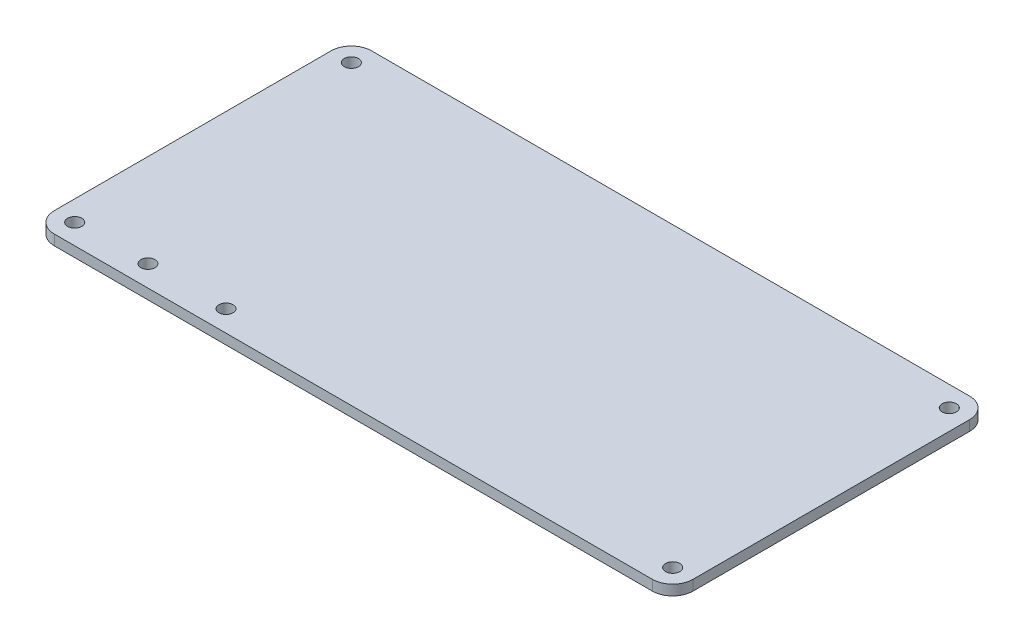
ISO-10303-21;
HEADER;
FILE_DESCRIPTION(('STEP AP214'),'2;1');
FILE_NAME('part.step','',(''),(''),'','','');
FILE_SCHEMA(('AUTOMOTIVE_DESIGN { 1 0 10303 214 1 1 1 1 }'));
ENDSEC;
DATA;
#1=APPLICATION_CONTEXT('core data for automotive mechanical design processes');
#2=APPLICATION_PROTOCOL_DEFINITION('international standard','automotive_design',2000,#1);
#3=PRODUCT_CONTEXT('',#1,'mechanical');
#4=PRODUCT('Part','Part','',(#3));
#5=PRODUCT_RELATED_PRODUCT_CATEGORY('part','',(#4));
#6=PRODUCT_DEFINITION_FORMATION('','',#4);
#7=PRODUCT_DEFINITION_CONTEXT('part definition',#1,'design');
#8=PRODUCT_DEFINITION('design','',#6,#7);
#9=PRODUCT_DEFINITION_SHAPE('','',#8);
#10=(LENGTH_UNIT() NAMED_UNIT(*) SI_UNIT(.MILLI.,.METRE.));
#11=(NAMED_UNIT(*) PLANE_ANGLE_UNIT() SI_UNIT($,.RADIAN.));
#12=(NAMED_UNIT(*) SI_UNIT($,.STERADIAN.) SOLID_ANGLE_UNIT());
#13=UNCERTAINTY_MEASURE_WITH_UNIT(LENGTH_MEASURE(1.E-05),#10,'distance_accuracy_value','');
#14=(GEOMETRIC_REPRESENTATION_CONTEXT(3) GLOBAL_UNCERTAINTY_ASSIGNED_CONTEXT((#13)) GLOBAL_UNIT_ASSIGNED_CONTEXT((#10,
#11,#12)) REPRESENTATION_CONTEXT('',''));
#15=CARTESIAN_POINT('',(0.,0.,0.));
#16=DIRECTION('',(0.,0.,1.));
#17=DIRECTION('',(1.,0.,0.));
#18=AXIS2_PLACEMENT_3D('',#15,#16,#17);
#19=CARTESIAN_POINT('',(3.175,1.6,-46.355));
#20=DIRECTION('',(0.,1.,0.));
#21=DIRECTION('',(0.,0.,1.));
#22=AXIS2_PLACEMENT_3D('',#19,#20,#21);
#23=PLANE('',#22);
#24=CARTESIAN_POINT('',(14.4784732794294,1.6,-3.30199999999999));
#25=DIRECTION('',(0.,1.,0.));
#26=DIRECTION('',(0.,0.,1.));
#27=AXIS2_PLACEMENT_3D('',#24,#25,#26);
#28=CIRCLE('',#27,1.1);
#29=CARTESIAN_POINT('',(14.4784732794294,1.6,-2.20199999999999));
#30=VERTEX_POINT('',#29);
#31=EDGE_CURVE('E251',#30,#30,#28,.T.);
#32=ORIENTED_EDGE('',*,*,#31,.F.);
#33=EDGE_LOOP('',(#32));
#34=FACE_BOUND('',#33,.T.);
#35=CARTESIAN_POINT('',(26.6684732794294,1.6,-3.302));
#36=DIRECTION('',(0.,1.,0.));
#37=DIRECTION('',(0.,0.,1.));
#38=AXIS2_PLACEMENT_3D('',#35,#36,#37);
#39=CIRCLE('',#38,1.1);
#40=CARTESIAN_POINT('',(26.6684732794294,1.6,-2.202));
#41=VERTEX_POINT('',#40);
#42=EDGE_CURVE('E243',#41,#41,#39,.T.);
#43=ORIENTED_EDGE('',*,*,#42,.F.);
#44=EDGE_LOOP('',(#43));
#45=FACE_BOUND('',#44,.T.);
#46=CARTESIAN_POINT('',(96.52,1.6,-3.17499999999997));
#47=DIRECTION('',(0.,1.,0.));
#48=DIRECTION('',(0.,0.,1.));
#49=AXIS2_PLACEMENT_3D('',#46,#47,#48);
#50=CIRCLE('',#49,1.11125);
#51=CARTESIAN_POINT('',(96.52,1.6,-2.06374999999997));
#52=VERTEX_POINT('',#51);
#53=EDGE_CURVE('E223',#52,#52,#50,.T.);
#54=ORIENTED_EDGE('',*,*,#53,.F.);
#55=EDGE_LOOP('',(#54));
#56=FACE_BOUND('',#55,.T.);
#57=CARTESIAN_POINT('',(3.175,1.6,-46.355));
#58=DIRECTION('',(0.,1.,0.));
#59=DIRECTION('',(0.,0.,1.));
#60=AXIS2_PLACEMENT_3D('',#57,#58,#59);
#61=CIRCLE('',#60,1.11125);
#62=CARTESIAN_POINT('',(3.175,1.6,-45.24375));
#63=VERTEX_POINT('',#62);
#64=EDGE_CURVE('E148',#63,#63,#61,.T.);
#65=ORIENTED_EDGE('',*,*,#64,.F.);
#66=EDGE_LOOP('',(#65));
#67=FACE_BOUND('',#66,.T.);
#68=CARTESIAN_POINT('',(3.175,1.6,-46.355));
#69=DIRECTION('',(0.,1.,0.));
#70=DIRECTION('',(0.,0.,1.));
#71=AXIS2_PLACEMENT_3D('',#68,#69,#70);
#72=CIRCLE('',#71,3.17500000000001);
#73=CARTESIAN_POINT('',(3.175,1.6,-49.53));
#74=VERTEX_POINT('',#73);
#75=CARTESIAN_POINT('',(0.,1.6,-46.355));
#76=VERTEX_POINT('',#75);
#77=EDGE_CURVE('E166',#74,#76,#72,.T.);
#78=ORIENTED_EDGE('',*,*,#77,.T.);
#79=DIRECTION('',(0.,0.,1.));
#80=VECTOR('',#79,1.);
#81=CARTESIAN_POINT('',(0.,1.6,-3.175));
#82=LINE('',#81,#80);
#83=CARTESIAN_POINT('',(0.,1.6,-3.175));
#84=VERTEX_POINT('',#83);
#85=EDGE_CURVE('E102',#76,#84,#82,.T.);
#86=ORIENTED_EDGE('',*,*,#85,.T.);
#87=CARTESIAN_POINT('',(3.175,1.6,-3.175));
#88=DIRECTION('',(0.,1.,0.));
#89=DIRECTION('',(0.,0.,-1.));
#90=AXIS2_PLACEMENT_3D('',#87,#88,#89);
#91=CIRCLE('',#90,3.17500000000001);
#92=CARTESIAN_POINT('',(3.175,1.6,0.));
#93=VERTEX_POINT('',#92);
#94=EDGE_CURVE('E187',#84,#93,#91,.T.);
#95=ORIENTED_EDGE('',*,*,#94,.T.);
#96=DIRECTION('',(1.,0.,0.));
#97=VECTOR('',#96,1.);
#98=CARTESIAN_POINT('',(3.175,1.6,0.));
#99=LINE('',#98,#97);
#100=CARTESIAN_POINT('',(96.52,1.6,0.));
#101=VERTEX_POINT('',#100);
#102=EDGE_CURVE('E201',#93,#101,#99,.T.);
#103=ORIENTED_EDGE('',*,*,#102,.T.);
#104=CARTESIAN_POINT('',(96.52,1.6,-3.17499999999997));
#105=DIRECTION('',(0.,1.,0.));
#106=DIRECTION('',(0.,0.,1.));
#107=AXIS2_PLACEMENT_3D('',#104,#105,#106);
#108=CIRCLE('',#107,3.175);
#109=CARTESIAN_POINT('',(99.695,1.6,-3.17499999999997));
#110=VERTEX_POINT('',#109);
#111=EDGE_CURVE('E121',#101,#110,#108,.T.);
#112=ORIENTED_EDGE('',*,*,#111,.T.);
#113=DIRECTION('',(0.,0.,-1.));
#114=VECTOR('',#113,1.);
#115=CARTESIAN_POINT('',(99.695,1.6,-3.17499999999997));
#116=LINE('',#115,#114);
#117=CARTESIAN_POINT('',(99.695,1.6,-46.355));
#118=VERTEX_POINT('',#117);
#119=EDGE_CURVE('E115',#110,#118,#116,.T.);
#120=ORIENTED_EDGE('',*,*,#119,.T.);
#121=CARTESIAN_POINT('',(96.52,1.6,-46.355));
#122=DIRECTION('',(0.,1.,0.));
#123=DIRECTION('',(0.,0.,-1.));
#124=AXIS2_PLACEMENT_3D('',#121,#122,#123);
#125=CIRCLE('',#124,3.175);
#126=CARTESIAN_POINT('',(96.52,1.6,-49.53));
#127=VERTEX_POINT('',#126);
#128=EDGE_CURVE('E119',#118,#127,#125,.T.);
#129=ORIENTED_EDGE('',*,*,#128,.T.);
#130=DIRECTION('',(-1.,0.,0.));
#131=VECTOR('',#130,1.);
#132=CARTESIAN_POINT('',(3.175,1.6,-49.53));
#133=LINE('',#132,#131);
#134=EDGE_CURVE('E59',#127,#74,#133,.T.);
#135=ORIENTED_EDGE('',*,*,#134,.T.);
#136=EDGE_LOOP('',(#78,#86,#95,#103,#112,#120,#129,#135));
#137=FACE_BOUND('',#136,.T.);
#138=CARTESIAN_POINT('',(96.52,1.6,-46.355));
#139=DIRECTION('',(0.,1.,0.));
#140=DIRECTION('',(0.,0.,-1.));
#141=AXIS2_PLACEMENT_3D('',#138,#139,#140);
#142=CIRCLE('',#141,1.11125);
#143=CARTESIAN_POINT('',(96.52,1.6,-47.46625));
#144=VERTEX_POINT('',#143);
#145=EDGE_CURVE('E215',#144,#144,#142,.T.);
#146=ORIENTED_EDGE('',*,*,#145,.F.);
#147=EDGE_LOOP('',(#146));
#148=FACE_BOUND('',#147,.T.);
#149=CARTESIAN_POINT('',(3.175,1.6,-3.175));
#150=DIRECTION('',(0.,1.,0.));
#151=DIRECTION('',(0.,0.,-1.));
#152=AXIS2_PLACEMENT_3D('',#149,#150,#151);
#153=CIRCLE('',#152,1.11125);
#154=CARTESIAN_POINT('',(3.175,1.6,-4.28625));
#155=VERTEX_POINT('',#154);
#156=EDGE_CURVE('E231',#155,#155,#153,.T.);
#157=ORIENTED_EDGE('',*,*,#156,.F.);
#158=EDGE_LOOP('',(#157));
#159=FACE_BOUND('',#158,.T.);
#160=ADVANCED_FACE('F41',(#34,#45,#56,#67,#137,#148,#159),#23,.T.);
#161=CARTESIAN_POINT('',(3.175,0.,-46.355));
#162=DIRECTION('',(0.,1.,0.));
#163=DIRECTION('',(0.,0.,1.));
#164=AXIS2_PLACEMENT_3D('',#161,#162,#163);
#165=PLANE('',#164);
#166=CARTESIAN_POINT('',(14.4784732794294,0.,-3.30199999999999));
#167=DIRECTION('',(0.,1.,0.));
#168=DIRECTION('',(0.,0.,1.));
#169=AXIS2_PLACEMENT_3D('',#166,#167,#168);
#170=CIRCLE('',#169,1.1);
#171=CARTESIAN_POINT('',(14.4784732794294,0.,-2.20199999999999));
#172=VERTEX_POINT('',#171);
#173=EDGE_CURVE('E239',#172,#172,#170,.T.);
#174=ORIENTED_EDGE('',*,*,#173,.T.);
#175=EDGE_LOOP('',(#174));
#176=FACE_BOUND('',#175,.T.);
#177=CARTESIAN_POINT('',(26.6684732794294,0.,-3.302));
#178=DIRECTION('',(0.,1.,0.));
#179=DIRECTION('',(0.,0.,1.));
#180=AXIS2_PLACEMENT_3D('',#177,#178,#179);
#181=CIRCLE('',#180,1.1);
#182=CARTESIAN_POINT('',(26.6684732794294,0.,-2.202));
#183=VERTEX_POINT('',#182);
#184=EDGE_CURVE('E247',#183,#183,#181,.T.);
#185=ORIENTED_EDGE('',*,*,#184,.T.);
#186=EDGE_LOOP('',(#185));
#187=FACE_BOUND('',#186,.T.);
#188=CARTESIAN_POINT('',(3.175,0.,-46.355));
#189=DIRECTION('',(0.,1.,0.));
#190=DIRECTION('',(0.,0.,1.));
#191=AXIS2_PLACEMENT_3D('',#188,#189,#190);
#192=CIRCLE('',#191,3.17500000000001);
#193=CARTESIAN_POINT('',(3.175,0.,-49.53));
#194=VERTEX_POINT('',#193);
#195=CARTESIAN_POINT('',(0.,0.,-46.355));
#196=VERTEX_POINT('',#195);
#197=EDGE_CURVE('E143',#194,#196,#192,.T.);
#198=ORIENTED_EDGE('',*,*,#197,.F.);
#199=DIRECTION('',(-1.,0.,0.));
#200=VECTOR('',#199,1.);
#201=CARTESIAN_POINT('',(3.175,0.,-49.53));
#202=LINE('',#201,#200);
#203=CARTESIAN_POINT('',(96.52,0.,-49.53));
#204=VERTEX_POINT('',#203);
#205=EDGE_CURVE('E94',#204,#194,#202,.T.);
#206=ORIENTED_EDGE('',*,*,#205,.F.);
#207=CARTESIAN_POINT('',(96.52,0.,-46.355));
#208=DIRECTION('',(0.,1.,0.));
#209=DIRECTION('',(0.,0.,-1.));
#210=AXIS2_PLACEMENT_3D('',#207,#208,#209);
#211=CIRCLE('',#210,3.175);
#212=CARTESIAN_POINT('',(99.695,0.,-46.355));
#213=VERTEX_POINT('',#212);
#214=EDGE_CURVE('E88',#213,#204,#211,.T.);
#215=ORIENTED_EDGE('',*,*,#214,.F.);
#216=DIRECTION('',(0.,0.,-1.));
#217=VECTOR('',#216,1.);
#218=CARTESIAN_POINT('',(99.695,0.,-3.17499999999997));
#219=LINE('',#218,#217);
#220=CARTESIAN_POINT('',(99.695,0.,-3.17499999999997));
#221=VERTEX_POINT('',#220);
#222=EDGE_CURVE('E130',#221,#213,#219,.T.);
#223=ORIENTED_EDGE('',*,*,#222,.F.);
#224=CARTESIAN_POINT('',(96.52,0.,-3.17499999999997));
#225=DIRECTION('',(0.,1.,0.));
#226=DIRECTION('',(0.,0.,1.));
#227=AXIS2_PLACEMENT_3D('',#224,#225,#226);
#228=CIRCLE('',#227,3.175);
#229=CARTESIAN_POINT('',(96.52,0.,0.));
#230=VERTEX_POINT('',#229);
#231=EDGE_CURVE('E157',#230,#221,#228,.T.);
#232=ORIENTED_EDGE('',*,*,#231,.F.);
#233=DIRECTION('',(1.,0.,0.));
#234=VECTOR('',#233,1.);
#235=CARTESIAN_POINT('',(3.175,0.,0.));
#236=LINE('',#235,#234);
#237=CARTESIAN_POINT('',(3.175,0.,0.));
#238=VERTEX_POINT('',#237);
#239=EDGE_CURVE('E154',#238,#230,#236,.T.);
#240=ORIENTED_EDGE('',*,*,#239,.F.);
#241=CARTESIAN_POINT('',(3.175,0.,-3.175));
#242=DIRECTION('',(0.,1.,0.));
#243=DIRECTION('',(0.,0.,-1.));
#244=AXIS2_PLACEMENT_3D('',#241,#242,#243);
#245=CIRCLE('',#244,3.17500000000001);
#246=CARTESIAN_POINT('',(0.,0.,-3.175));
#247=VERTEX_POINT('',#246);
#248=EDGE_CURVE('E151',#247,#238,#245,.T.);
#249=ORIENTED_EDGE('',*,*,#248,.F.);
#250=DIRECTION('',(0.,0.,1.));
#251=VECTOR('',#250,1.);
#252=CARTESIAN_POINT('',(0.,0.,-3.175));
#253=LINE('',#252,#251);
#254=EDGE_CURVE('E147',#196,#247,#253,.T.);
#255=ORIENTED_EDGE('',*,*,#254,.F.);
#256=EDGE_LOOP('',(#198,#206,#215,#223,#232,#240,#249,#255));
#257=FACE_BOUND('',#256,.T.);
#258=CARTESIAN_POINT('',(3.175,0.,-46.355));
#259=DIRECTION('',(0.,1.,0.));
#260=DIRECTION('',(0.,0.,1.));
#261=AXIS2_PLACEMENT_3D('',#258,#259,#260);
#262=CIRCLE('',#261,1.11125);
#263=CARTESIAN_POINT('',(3.175,0.,-45.24375));
#264=VERTEX_POINT('',#263);
#265=EDGE_CURVE('E211',#264,#264,#262,.T.);
#266=ORIENTED_EDGE('',*,*,#265,.T.);
#267=EDGE_LOOP('',(#266));
#268=FACE_BOUND('',#267,.T.);
#269=CARTESIAN_POINT('',(96.52,0.,-46.355));
#270=DIRECTION('',(0.,1.,0.));
#271=DIRECTION('',(0.,0.,-1.));
#272=AXIS2_PLACEMENT_3D('',#269,#270,#271);
#273=CIRCLE('',#272,1.11125);
#274=CARTESIAN_POINT('',(96.52,0.,-47.46625));
#275=VERTEX_POINT('',#274);
#276=EDGE_CURVE('E219',#275,#275,#273,.T.);
#277=ORIENTED_EDGE('',*,*,#276,.T.);
#278=EDGE_LOOP('',(#277));
#279=FACE_BOUND('',#278,.T.);
#280=CARTESIAN_POINT('',(96.52,0.,-3.17499999999997));
#281=DIRECTION('',(0.,1.,0.));
#282=DIRECTION('',(0.,0.,1.));
#283=AXIS2_PLACEMENT_3D('',#280,#281,#282);
#284=CIRCLE('',#283,1.11125);
#285=CARTESIAN_POINT('',(96.52,0.,-2.06374999999997));
#286=VERTEX_POINT('',#285);
#287=EDGE_CURVE('E227',#286,#286,#284,.T.);
#288=ORIENTED_EDGE('',*,*,#287,.T.);
#289=EDGE_LOOP('',(#288));
#290=FACE_BOUND('',#289,.T.);
#291=CARTESIAN_POINT('',(3.175,0.,-3.175));
#292=DIRECTION('',(0.,1.,0.));
#293=DIRECTION('',(0.,0.,-1.));
#294=AXIS2_PLACEMENT_3D('',#291,#292,#293);
#295=CIRCLE('',#294,1.11125);
#296=CARTESIAN_POINT('',(3.175,0.,-4.28625));
#297=VERTEX_POINT('',#296);
#298=EDGE_CURVE('E235',#297,#297,#295,.T.);
#299=ORIENTED_EDGE('',*,*,#298,.T.);
#300=EDGE_LOOP('',(#299));
#301=FACE_BOUND('',#300,.T.);
#302=ADVANCED_FACE('F191',(#176,#187,#257,#268,#279,#290,#301),#165,.F.);
#303=CARTESIAN_POINT('',(3.175,1.6,-46.355));
#304=DIRECTION('',(0.,-1.,0.));
#305=DIRECTION('',(0.,0.,-1.));
#306=AXIS2_PLACEMENT_3D('',#303,#304,#305);
#307=CYLINDRICAL_SURFACE('',#306,3.17500000000001);
#308=ORIENTED_EDGE('',*,*,#197,.T.);
#309=DIRECTION('',(0.,-1.,0.));
#310=VECTOR('',#309,1.);
#311=CARTESIAN_POINT('',(0.,1.6,-46.355));
#312=LINE('',#311,#310);
#313=EDGE_CURVE('E11',#76,#196,#312,.T.);
#314=ORIENTED_EDGE('',*,*,#313,.F.);
#315=ORIENTED_EDGE('',*,*,#77,.F.);
#316=DIRECTION('',(0.,-1.,0.));
#317=VECTOR('',#316,1.);
#318=CARTESIAN_POINT('',(3.175,1.6,-49.53));
#319=LINE('',#318,#317);
#320=EDGE_CURVE('E139',#74,#194,#319,.T.);
#321=ORIENTED_EDGE('',*,*,#320,.T.);
#322=EDGE_LOOP('',(#308,#314,#315,#321));
#323=FACE_BOUND('',#322,.T.);
#324=ADVANCED_FACE('F43',(#323),#307,.T.);
#325=CARTESIAN_POINT('',(0.,1.6,-3.175));
#326=DIRECTION('',(1.,0.,0.));
#327=DIRECTION('',(0.,0.,-1.));
#328=AXIS2_PLACEMENT_3D('',#325,#326,#327);
#329=PLANE('',#328);
#330=ORIENTED_EDGE('',*,*,#254,.T.);
#331=DIRECTION('',(0.,-1.,0.));
#332=VECTOR('',#331,1.);
#333=CARTESIAN_POINT('',(0.,1.6,-3.175));
#334=LINE('',#333,#332);
#335=EDGE_CURVE('E51',#84,#247,#334,.T.);
#336=ORIENTED_EDGE('',*,*,#335,.F.);
#337=ORIENTED_EDGE('',*,*,#85,.F.);
#338=ORIENTED_EDGE('',*,*,#313,.T.);
#339=EDGE_LOOP('',(#330,#336,#337,#338));
#340=FACE_BOUND('',#339,.T.);
#341=ADVANCED_FACE('F321',(#340),#329,.F.);
#342=CARTESIAN_POINT('',(3.175,1.6,-3.175));
#343=DIRECTION('',(0.,-1.,0.));
#344=DIRECTION('',(0.,0.,-1.));
#345=AXIS2_PLACEMENT_3D('',#342,#343,#344);
#346=CYLINDRICAL_SURFACE('',#345,3.17500000000001);
#347=ORIENTED_EDGE('',*,*,#248,.T.);
#348=DIRECTION('',(0.,-1.,0.));
#349=VECTOR('',#348,1.);
#350=CARTESIAN_POINT('',(3.175,1.6,0.));
#351=LINE('',#350,#349);
#352=EDGE_CURVE('E177',#93,#238,#351,.T.);
#353=ORIENTED_EDGE('',*,*,#352,.F.);
#354=ORIENTED_EDGE('',*,*,#94,.F.);
#355=ORIENTED_EDGE('',*,*,#335,.T.);
#356=EDGE_LOOP('',(#347,#353,#354,#355));
#357=FACE_BOUND('',#356,.T.);
#358=ADVANCED_FACE('F185',(#357),#346,.T.);
#359=CARTESIAN_POINT('',(3.175,1.6,0.));
#360=DIRECTION('',(0.,0.,-1.));
#361=DIRECTION('',(-1.,0.,0.));
#362=AXIS2_PLACEMENT_3D('',#359,#360,#361);
#363=PLANE('',#362);
#364=ORIENTED_EDGE('',*,*,#239,.T.);
#365=DIRECTION('',(0.,-1.,0.));
#366=VECTOR('',#365,1.);
#367=CARTESIAN_POINT('',(96.52,1.6,0.));
#368=LINE('',#367,#366);
#369=EDGE_CURVE('E173',#101,#230,#368,.T.);
#370=ORIENTED_EDGE('',*,*,#369,.F.);
#371=ORIENTED_EDGE('',*,*,#102,.F.);
#372=ORIENTED_EDGE('',*,*,#352,.T.);
#373=EDGE_LOOP('',(#364,#370,#371,#372));
#374=FACE_BOUND('',#373,.T.);
#375=ADVANCED_FACE('F196',(#374),#363,.F.);
#376=CARTESIAN_POINT('',(96.52,1.6,-3.17499999999997));
#377=DIRECTION('',(0.,-1.,0.));
#378=DIRECTION('',(0.,0.,-1.));
#379=AXIS2_PLACEMENT_3D('',#376,#377,#378);
#380=CYLINDRICAL_SURFACE('',#379,3.175);
#381=ORIENTED_EDGE('',*,*,#231,.T.);
#382=DIRECTION('',(0.,-1.,0.));
#383=VECTOR('',#382,1.);
#384=CARTESIAN_POINT('',(99.695,1.6,-3.17499999999997));
#385=LINE('',#384,#383);
#386=EDGE_CURVE('E132',#110,#221,#385,.T.);
#387=ORIENTED_EDGE('',*,*,#386,.F.);
#388=ORIENTED_EDGE('',*,*,#111,.F.);
#389=ORIENTED_EDGE('',*,*,#369,.T.);
#390=EDGE_LOOP('',(#381,#387,#388,#389));
#391=FACE_BOUND('',#390,.T.);
#392=ADVANCED_FACE('F199',(#391),#380,.T.);
#393=CARTESIAN_POINT('',(99.695,1.6,-3.17499999999997));
#394=DIRECTION('',(-1.,0.,0.));
#395=DIRECTION('',(0.,0.,1.));
#396=AXIS2_PLACEMENT_3D('',#393,#394,#395);
#397=PLANE('',#396);
#398=ORIENTED_EDGE('',*,*,#222,.T.);
#399=DIRECTION('',(0.,-1.,0.));
#400=VECTOR('',#399,1.);
#401=CARTESIAN_POINT('',(99.695,1.6,-46.355));
#402=LINE('',#401,#400);
#403=EDGE_CURVE('E127',#118,#213,#402,.T.);
#404=ORIENTED_EDGE('',*,*,#403,.F.);
#405=ORIENTED_EDGE('',*,*,#119,.F.);
#406=ORIENTED_EDGE('',*,*,#386,.T.);
#407=EDGE_LOOP('',(#398,#404,#405,#406));
#408=FACE_BOUND('',#407,.T.);
#409=ADVANCED_FACE('F128',(#408),#397,.F.);
#410=CARTESIAN_POINT('',(96.52,1.6,-46.355));
#411=DIRECTION('',(0.,-1.,0.));
#412=DIRECTION('',(0.,0.,-1.));
#413=AXIS2_PLACEMENT_3D('',#410,#411,#412);
#414=CYLINDRICAL_SURFACE('',#413,3.175);
#415=ORIENTED_EDGE('',*,*,#214,.T.);
#416=DIRECTION('',(0.,-1.,0.));
#417=VECTOR('',#416,1.);
#418=CARTESIAN_POINT('',(96.52,1.6,-49.53));
#419=LINE('',#418,#417);
#420=EDGE_CURVE('E133',#127,#204,#419,.T.);
#421=ORIENTED_EDGE('',*,*,#420,.F.);
#422=ORIENTED_EDGE('',*,*,#128,.F.);
#423=ORIENTED_EDGE('',*,*,#403,.T.);
#424=EDGE_LOOP('',(#415,#421,#422,#423));
#425=FACE_BOUND('',#424,.T.);
#426=ADVANCED_FACE('F135',(#425),#414,.T.);
#427=CARTESIAN_POINT('',(3.175,1.6,-49.53));
#428=DIRECTION('',(0.,0.,1.));
#429=DIRECTION('',(1.,0.,0.));
#430=AXIS2_PLACEMENT_3D('',#427,#428,#429);
#431=PLANE('',#430);
#432=ORIENTED_EDGE('',*,*,#205,.T.);
#433=ORIENTED_EDGE('',*,*,#320,.F.);
#434=ORIENTED_EDGE('',*,*,#134,.F.);
#435=ORIENTED_EDGE('',*,*,#420,.T.);
#436=EDGE_LOOP('',(#432,#433,#434,#435));
#437=FACE_BOUND('',#436,.T.);
#438=ADVANCED_FACE('F281',(#437),#431,.F.);
#439=CARTESIAN_POINT('',(3.175,1.6,-46.355));
#440=DIRECTION('',(0.,-1.,0.));
#441=DIRECTION('',(0.,0.,-1.));
#442=AXIS2_PLACEMENT_3D('',#439,#440,#441);
#443=CYLINDRICAL_SURFACE('',#442,1.11125);
#444=ORIENTED_EDGE('',*,*,#64,.T.);
#445=EDGE_LOOP('',(#444));
#446=FACE_BOUND('',#445,.T.);
#447=ORIENTED_EDGE('',*,*,#265,.F.);
#448=EDGE_LOOP('',(#447));
#449=FACE_BOUND('',#448,.T.);
#450=ADVANCED_FACE('F277',(#446,#449),#443,.F.);
#451=CARTESIAN_POINT('',(96.52,1.6,-46.355));
#452=DIRECTION('',(0.,-1.,0.));
#453=DIRECTION('',(0.,0.,-1.));
#454=AXIS2_PLACEMENT_3D('',#451,#452,#453);
#455=CYLINDRICAL_SURFACE('',#454,1.11125);
#456=ORIENTED_EDGE('',*,*,#145,.T.);
#457=EDGE_LOOP('',(#456));
#458=FACE_BOUND('',#457,.T.);
#459=ORIENTED_EDGE('',*,*,#276,.F.);
#460=EDGE_LOOP('',(#459));
#461=FACE_BOUND('',#460,.T.);
#462=ADVANCED_FACE('F280',(#458,#461),#455,.F.);
#463=CARTESIAN_POINT('',(96.52,1.6,-3.17499999999997));
#464=DIRECTION('',(0.,-1.,0.));
#465=DIRECTION('',(0.,0.,-1.));
#466=AXIS2_PLACEMENT_3D('',#463,#464,#465);
#467=CYLINDRICAL_SURFACE('',#466,1.11125);
#468=ORIENTED_EDGE('',*,*,#53,.T.);
#469=EDGE_LOOP('',(#468));
#470=FACE_BOUND('',#469,.T.);
#471=ORIENTED_EDGE('',*,*,#287,.F.);
#472=EDGE_LOOP('',(#471));
#473=FACE_BOUND('',#472,.T.);
#474=ADVANCED_FACE('F295',(#470,#473),#467,.F.);
#475=CARTESIAN_POINT('',(3.175,1.6,-3.175));
#476=DIRECTION('',(0.,-1.,0.));
#477=DIRECTION('',(0.,0.,-1.));
#478=AXIS2_PLACEMENT_3D('',#475,#476,#477);
#479=CYLINDRICAL_SURFACE('',#478,1.11125);
#480=ORIENTED_EDGE('',*,*,#156,.T.);
#481=EDGE_LOOP('',(#480));
#482=FACE_BOUND('',#481,.T.);
#483=ORIENTED_EDGE('',*,*,#298,.F.);
#484=EDGE_LOOP('',(#483));
#485=FACE_BOUND('',#484,.T.);
#486=ADVANCED_FACE('F293',(#482,#485),#479,.F.);
#487=CARTESIAN_POINT('',(26.6684732794294,0.,-3.302));
#488=DIRECTION('',(0.,1.,0.));
#489=DIRECTION('',(0.,0.,1.));
#490=AXIS2_PLACEMENT_3D('',#487,#488,#489);
#491=CYLINDRICAL_SURFACE('',#490,1.1);
#492=ORIENTED_EDGE('',*,*,#184,.F.);
#493=EDGE_LOOP('',(#492));
#494=FACE_BOUND('',#493,.T.);
#495=ORIENTED_EDGE('',*,*,#42,.T.);
#496=EDGE_LOOP('',(#495));
#497=FACE_BOUND('',#496,.T.);
#498=ADVANCED_FACE('F264',(#494,#497),#491,.F.);
#499=CARTESIAN_POINT('',(14.4784732794294,0.,-3.30199999999999));
#500=DIRECTION('',(0.,1.,0.));
#501=DIRECTION('',(0.,0.,1.));
#502=AXIS2_PLACEMENT_3D('',#499,#500,#501);
#503=CYLINDRICAL_SURFACE('',#502,1.1);
#504=ORIENTED_EDGE('',*,*,#173,.F.);
#505=EDGE_LOOP('',(#504));
#506=FACE_BOUND('',#505,.T.);
#507=ORIENTED_EDGE('',*,*,#31,.T.);
#508=EDGE_LOOP('',(#507));
#509=FACE_BOUND('',#508,.T.);
#510=ADVANCED_FACE('F261',(#506,#509),#503,.F.);
#511=CLOSED_SHELL('',(#160,#302,#324,#341,#358,#375,#392,#409,#426,#438,#450,#462,#474,#486,
#498,#510));
#512=MANIFOLD_SOLID_BREP('B2',#511);
#513=ADVANCED_BREP_SHAPE_REPRESENTATION('',(#18,#512),#14);
#514=SHAPE_DEFINITION_REPRESENTATION(#9,#513);
ENDSEC;
END-ISO-10303-21;
